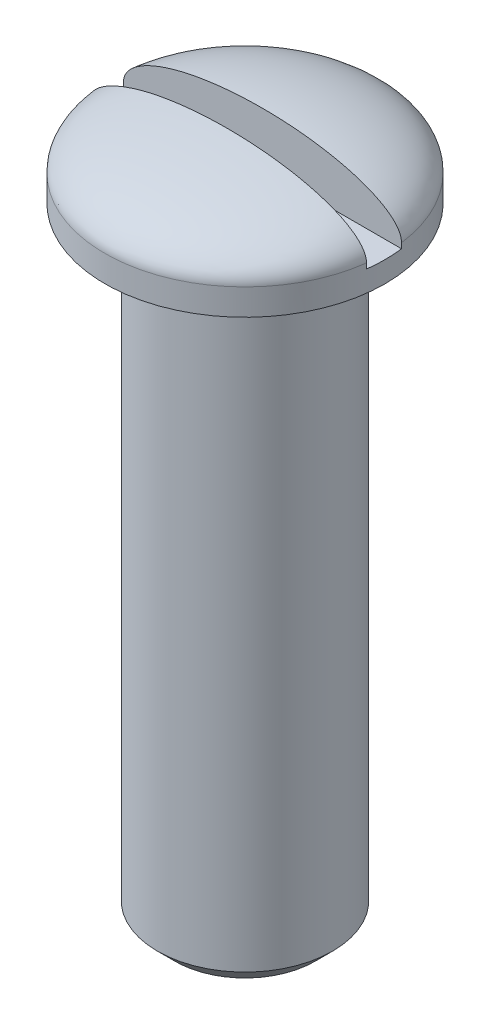
ISO-10303-21;
HEADER;
FILE_DESCRIPTION(('STEP AP214'),'2;1');
FILE_NAME('part.step','',(''),(''),'','','');
FILE_SCHEMA(('AUTOMOTIVE_DESIGN { 1 0 10303 214 1 1 1 1 }'));
ENDSEC;
DATA;
#1=APPLICATION_CONTEXT('core data for automotive mechanical design processes');
#2=APPLICATION_PROTOCOL_DEFINITION('international standard','automotive_design',2000,#1);
#3=PRODUCT_CONTEXT('',#1,'mechanical');
#4=PRODUCT('Part','Part','',(#3));
#5=PRODUCT_RELATED_PRODUCT_CATEGORY('part','',(#4));
#6=PRODUCT_DEFINITION_FORMATION('','',#4);
#7=PRODUCT_DEFINITION_CONTEXT('part definition',#1,'design');
#8=PRODUCT_DEFINITION('design','',#6,#7);
#9=PRODUCT_DEFINITION_SHAPE('','',#8);
#10=(LENGTH_UNIT() NAMED_UNIT(*) SI_UNIT(.MILLI.,.METRE.));
#11=(NAMED_UNIT(*) PLANE_ANGLE_UNIT() SI_UNIT($,.RADIAN.));
#12=(NAMED_UNIT(*) SI_UNIT($,.STERADIAN.) SOLID_ANGLE_UNIT());
#13=UNCERTAINTY_MEASURE_WITH_UNIT(LENGTH_MEASURE(1.E-05),#10,'distance_accuracy_value','');
#14=(GEOMETRIC_REPRESENTATION_CONTEXT(3) GLOBAL_UNCERTAINTY_ASSIGNED_CONTEXT((#13)) GLOBAL_UNIT_ASSIGNED_CONTEXT((#10,
#11,#12)) REPRESENTATION_CONTEXT('',''));
#15=CARTESIAN_POINT('',(0.,0.,0.));
#16=DIRECTION('',(0.,0.,1.));
#17=DIRECTION('',(1.,0.,0.));
#18=AXIS2_PLACEMENT_3D('',#15,#16,#17);
#19=CARTESIAN_POINT('',(0.,37.,0.));
#20=DIRECTION('',(0.,0.,1.));
#21=DIRECTION('',(1.,0.,0.));
#22=AXIS2_PLACEMENT_3D('',#19,#20,#21);
#23=ELLIPSE('',#22,8.,2.7);
#24=TRIMMED_CURVE('',#23,(PARAMETER_VALUE(-1.5707963267949)),(PARAMETER_VALUE(1.5707963267949)),
.T.,.PARAMETER.);
#25=CARTESIAN_POINT('',(0.,0.,0.));
#26=DIRECTION('',(0.,-1.,0.));
#27=AXIS1_PLACEMENT('',#25,#26);
#28=SURFACE_OF_REVOLUTION('',#24,#27);
#29=CARTESIAN_POINT('',(-7.93725393319377,37.,1.));
#30=CARTESIAN_POINT('',(-7.9372679539927,37.028425186696,1.));
#31=CARTESIAN_POINT('',(-7.93591384815377,37.0568421998398,1.));
#32=CARTESIAN_POINT('',(-7.93057860445809,37.1133921509441,1.));
#33=CARTESIAN_POINT('',(-7.92660092033622,37.141525413073,1.));
#34=CARTESIAN_POINT('',(-7.91619381617088,37.1969612867804,1.));
#35=CARTESIAN_POINT('',(-7.9097962183802,37.2242699119832,1.));
#36=CARTESIAN_POINT('',(-7.89472838102949,37.2782541235067,0.999999999999999));
#37=CARTESIAN_POINT('',(-7.88605729440098,37.3049294698286,0.999999999999997));
#38=CARTESIAN_POINT('',(-7.85178063449509,37.3977492993282,0.999999999999993));
#39=CARTESIAN_POINT('',(-7.82055716977038,37.461864801042,0.999999999999998));
#40=CARTESIAN_POINT('',(-7.74825690551775,37.5844958132068,1.));
#41=CARTESIAN_POINT('',(-7.70712574237137,37.6429778439168,1.));
#42=CARTESIAN_POINT('',(-7.62460477383432,37.7460593120359,1.));
#43=CARTESIAN_POINT('',(-7.58416021714071,37.7914307085018,1.));
#44=CARTESIAN_POINT('',(-7.49949954701128,37.8785364853327,1.));
#45=CARTESIAN_POINT('',(-7.45528055201993,37.920268036859,1.));
#46=CARTESIAN_POINT('',(-7.36394506845197,38.0005355231512,1.));
#47=CARTESIAN_POINT('',(-7.31682453080931,38.0390668075451,1.));
#48=CARTESIAN_POINT('',(-7.22040376655296,38.1132464906887,1.));
#49=CARTESIAN_POINT('',(-7.17110414952075,38.1488956878849,1.));
#50=CARTESIAN_POINT('',(-7.05152178589472,38.2308701890934,1.));
#51=CARTESIAN_POINT('',(-6.98044898629355,38.2760404643861,1.));
#52=CARTESIAN_POINT('',(-6.8358482477968,38.3622929197311,1.));
#53=CARTESIAN_POINT('',(-6.76231921632544,38.4033732472718,1.));
#54=CARTESIAN_POINT('',(-6.61329455065616,38.4820633862059,1.));
#55=CARTESIAN_POINT('',(-6.53779612171528,38.5196678782305,1.));
#56=CARTESIAN_POINT('',(-6.38533535109786,38.5917942620324,1.));
#57=CARTESIAN_POINT('',(-6.30837275926801,38.6263156212117,1.));
#58=CARTESIAN_POINT('',(-6.07504498630673,38.7261169145836,1.));
#59=CARTESIAN_POINT('',(-5.91691686569097,38.7872866492436,1.));
#60=CARTESIAN_POINT('',(-5.59773824980062,38.9007826154434,1.));
#61=CARTESIAN_POINT('',(-5.43669046126721,38.9531166162706,1.));
#62=CARTESIAN_POINT('',(-5.11838729614728,39.0486486509022,1.));
#63=CARTESIAN_POINT('',(-4.96121112165104,39.092112450686,1.));
#64=CARTESIAN_POINT('',(-4.64533614080023,39.173148532359,1.));
#65=CARTESIAN_POINT('',(-4.4866371255672,39.2107199934119,1.));
#66=CARTESIAN_POINT('',(-4.1678604359053,39.2806895318816,1.));
#67=CARTESIAN_POINT('',(-4.00778105851083,39.313079811176,1.));
#68=CARTESIAN_POINT('',(-3.68673226498379,39.3731227554639,1.));
#69=CARTESIAN_POINT('',(-3.52576278469573,39.4007750742435,1.));
#70=CARTESIAN_POINT('',(-3.0416024744178,39.4772597557472,1.));
#71=CARTESIAN_POINT('',(-2.7173689548059,39.5195751626911,1.));
#72=CARTESIAN_POINT('',(-2.06670375945056,39.5889826128706,1.));
#73=CARTESIAN_POINT('',(-1.74026908381822,39.6160456762821,1.));
#74=CARTESIAN_POINT('',(-1.0868675348501,39.6559517029133,1.));
#75=CARTESIAN_POINT('',(-0.759901523204662,39.6688088956982,1.));
#76=CARTESIAN_POINT('',(-0.105842030838195,39.6808640766637,1.));
#77=CARTESIAN_POINT('',(0.221251354184301,39.6800672551695,1.));
#78=CARTESIAN_POINT('',(0.805290745504496,39.6664179409489,1.));
#79=CARTESIAN_POINT('',(1.06230047698938,39.6561762053847,1.));
#80=CARTESIAN_POINT('',(1.5758871235112,39.6269652511818,1.));
#81=CARTESIAN_POINT('',(1.83246393174541,39.6079941266835,1.));
#82=CARTESIAN_POINT('',(2.34490379464668,39.5608224933159,1.));
#83=CARTESIAN_POINT('',(2.60076642804317,39.5326173721284,1.));
#84=CARTESIAN_POINT('',(3.10976030056053,39.4663704493105,1.));
#85=CARTESIAN_POINT('',(3.36289880378432,39.4283851568984,1.));
#86=CARTESIAN_POINT('',(3.86716913883653,39.3413164140507,1.));
#87=CARTESIAN_POINT('',(4.11830173526058,39.2922374239431,1.));
#88=CARTESIAN_POINT('',(4.61755910251831,39.1811940716012,1.));
#89=CARTESIAN_POINT('',(4.86568622251569,39.1192405666533,1.));
#90=CARTESIAN_POINT('',(5.20204631769779,39.0236658400096,1.));
#91=CARTESIAN_POINT('',(5.29223913160667,38.9968795643075,1.));
#92=CARTESIAN_POINT('',(5.47189294855613,38.9409436912467,1.));
#93=CARTESIAN_POINT('',(5.5613539536697,38.9117941005851,1.));
#94=CARTESIAN_POINT('',(5.73961871133747,38.8508089779762,1.));
#95=CARTESIAN_POINT('',(5.82842014912198,38.8189666570215,1.));
#96=CARTESIAN_POINT('',(6.00491789080109,38.7523528819634,1.));
#97=CARTESIAN_POINT('',(6.09261423406394,38.7175815325458,1.));
#98=CARTESIAN_POINT('',(6.2776295683126,38.6401174364544,1.));
#99=CARTESIAN_POINT('',(6.37476339184213,38.5969789898256,1.));
#100=CARTESIAN_POINT('',(6.56669545755528,38.5057942312038,1.));
#101=CARTESIAN_POINT('',(6.66149417144632,38.4577489206899,1.));
#102=CARTESIAN_POINT('',(6.84759019964439,38.3559697683412,1.));
#103=CARTESIAN_POINT('',(6.93889852072794,38.302256240792,1.));
#104=CARTESIAN_POINT('',(7.11693757439327,38.187786452014,1.));
#105=CARTESIAN_POINT('',(7.20367310459747,38.1270377947718,1.));
#106=CARTESIAN_POINT('',(7.35169707600426,38.0113239182405,1.));
#107=CARTESIAN_POINT('',(7.41433656069576,37.9581066351191,1.));
#108=CARTESIAN_POINT('',(7.53389423860408,37.8452426401833,1.));
#109=CARTESIAN_POINT('',(7.59079865654612,37.7855811292181,1.));
#110=CARTESIAN_POINT('',(7.69680275770274,37.6577690604176,1.));
#111=CARTESIAN_POINT('',(7.7457630485013,37.5894979859558,0.999999999999999));
#112=CARTESIAN_POINT('',(7.80882672013688,37.481331738079,1.));
#113=CARTESIAN_POINT('',(7.82807745616976,37.4444318562314,1.));
#114=CARTESIAN_POINT('',(7.86249520103261,37.3687911619656,0.999999999999999));
#115=CARTESIAN_POINT('',(7.87766543085493,37.3300518301273,0.999999999999997));
#116=CARTESIAN_POINT('',(7.90549829208587,37.2439124725726,0.999999999999997));
#117=CARTESIAN_POINT('',(7.91723093808099,37.1962001972984,0.999999999999999));
#118=CARTESIAN_POINT('',(7.92915192399331,37.123467437178,1.));
#119=CARTESIAN_POINT('',(7.93217994650022,37.0988886368039,1.));
#120=CARTESIAN_POINT('',(7.93623444838613,37.0495440864978,1.));
#121=CARTESIAN_POINT('',(7.93725906810871,37.0247781842705,1.));
#122=CARTESIAN_POINT('',(7.93725393319377,37.,1.));
#123=B_SPLINE_CURVE_WITH_KNOTS('',3,(#29,#30,#31,#32,#33,#34,#35,#36,#37,#38,#39,#40,#41,#42,
#43,#44,#45,#46,#47,#48,#49,#50,#51,#52,#53,#54,#55,#56,#57,#58,#59,#60,#61,#62,#63,#64,#65,#66,
#67,#68,#69,#70,#71,#72,#73,#74,#75,#76,#77,#78,#79,#80,#81,#82,#83,#84,#85,#86,#87,#88,#89,#90,
#91,#92,#93,#94,#95,#96,#97,#98,#99,#100,#101,#102,#103,#104,#105,#106,#107,#108,#109,#110,#111,
#112,#113,#114,#115,#116,#117,#118,#119,#120,#121,#122),.UNSPECIFIED.,.F.,.F.,(4,2,2,2,2,2,2,2,
2,2,2,2,2,2,2,2,2,2,2,2,2,2,2,2,2,2,2,2,2,2,2,2,2,2,2,2,2,2,2,2,2,2,2,2,2,2,4),(0.,
0.085230121730039,0.170348268030959,0.254383958606268,0.33845100424637,0.551085654244598,
0.764914730326498,0.946993520486736,1.12921258182631,1.31169195823799,1.494120606517,
1.7465796309848,1.99915248957964,2.25210569478696,2.50510251241691,3.01337352121526,
3.52119525149152,4.01028728520159,4.49944739181178,4.98933693637674,5.47926226308226,
6.45975371972949,7.44210190711809,8.42346521325528,9.40445548025946,10.1759607647509,
10.9476345695116,11.7196944096484,12.487389709664,13.2547768976915,14.0215195429876,
14.3037539915994,14.5859876404534,14.8689553875985,15.1519130255422,15.4706443815909,
15.7893108148479,16.1068716569271,16.4240924087716,16.6703252972271,16.917136190868,
17.1678947543991,17.2925517948105,17.4171101451146,17.5638867740028,17.6381082525873,
17.71239859453),.UNSPECIFIED.);
#124=CARTESIAN_POINT('',(-7.93725393319377,37.,1.));
#125=VERTEX_POINT('',#124);
#126=CARTESIAN_POINT('',(7.93725393319377,37.,1.));
#127=VERTEX_POINT('',#126);
#128=EDGE_CURVE('E69',#125,#127,#123,.T.);
#129=ORIENTED_EDGE('',*,*,#128,.F.);
#130=CARTESIAN_POINT('',(0.,37.,0.));
#131=DIRECTION('',(0.,-1.,0.));
#132=DIRECTION('',(1.,0.,0.));
#133=AXIS2_PLACEMENT_3D('',#130,#131,#132);
#134=CIRCLE('',#133,8.);
#135=EDGE_CURVE('E155',#127,#125,#134,.T.);
#136=ORIENTED_EDGE('',*,*,#135,.F.);
#137=EDGE_LOOP('',(#129,#136));
#138=FACE_BOUND('',#137,.T.);
#139=ADVANCED_FACE('F45',(#138),#28,.F.);
#140=CARTESIAN_POINT('',(0.,0.,0.));
#141=DIRECTION('',(0.,-1.,0.));
#142=DIRECTION('',(1.,0.,0.));
#143=AXIS2_PLACEMENT_3D('',#140,#141,#142);
#144=PLANE('',#143);
#145=CARTESIAN_POINT('',(0.,0.,0.));
#146=DIRECTION('',(0.,-1.,0.));
#147=DIRECTION('',(1.,0.,0.));
#148=AXIS2_PLACEMENT_3D('',#145,#146,#147);
#149=CIRCLE('',#148,3.99999999999999);
#150=CARTESIAN_POINT('',(3.99999999999999,0.,0.));
#151=VERTEX_POINT('',#150);
#152=EDGE_CURVE('E162',#151,#151,#149,.T.);
#153=ORIENTED_EDGE('',*,*,#152,.T.);
#154=EDGE_LOOP('',(#153));
#155=FACE_BOUND('',#154,.T.);
#156=ADVANCED_FACE('F146',(#155),#144,.T.);
#157=CARTESIAN_POINT('',(0.,0.,0.));
#158=DIRECTION('',(0.,-1.,0.));
#159=DIRECTION('',(1.,0.,0.));
#160=AXIS2_PLACEMENT_3D('',#157,#158,#159);
#161=CYLINDRICAL_SURFACE('',#160,5.);
#162=CARTESIAN_POINT('',(0.,1.00000000000001,0.));
#163=DIRECTION('',(0.,-1.,0.));
#164=DIRECTION('',(1.,0.,0.));
#165=AXIS2_PLACEMENT_3D('',#162,#163,#164);
#166=CIRCLE('',#165,5.);
#167=CARTESIAN_POINT('',(5.,1.00000000000001,0.));
#168=VERTEX_POINT('',#167);
#169=EDGE_CURVE('E166',#168,#168,#166,.F.);
#170=ORIENTED_EDGE('',*,*,#169,.T.);
#171=EDGE_LOOP('',(#170));
#172=FACE_BOUND('',#171,.T.);
#173=CARTESIAN_POINT('',(0.,35.5,0.));
#174=DIRECTION('',(0.,-1.,0.));
#175=DIRECTION('',(1.,0.,0.));
#176=AXIS2_PLACEMENT_3D('',#173,#174,#175);
#177=CIRCLE('',#176,5.);
#178=CARTESIAN_POINT('',(5.,35.5,0.));
#179=VERTEX_POINT('',#178);
#180=EDGE_CURVE('E158',#179,#179,#177,.T.);
#181=ORIENTED_EDGE('',*,*,#180,.T.);
#182=EDGE_LOOP('',(#181));
#183=FACE_BOUND('',#182,.T.);
#184=ADVANCED_FACE('F151',(#172,#183),#161,.T.);
#185=CARTESIAN_POINT('',(5.,35.5,0.));
#186=DIRECTION('',(0.,-1.,0.));
#187=DIRECTION('',(1.,0.,0.));
#188=AXIS2_PLACEMENT_3D('',#185,#186,#187);
#189=PLANE('',#188);
#190=CARTESIAN_POINT('',(0.,35.5,0.));
#191=DIRECTION('',(0.,-1.,0.));
#192=DIRECTION('',(1.,0.,0.));
#193=AXIS2_PLACEMENT_3D('',#190,#191,#192);
#194=CIRCLE('',#193,8.);
#195=CARTESIAN_POINT('',(8.,35.5,0.));
#196=VERTEX_POINT('',#195);
#197=EDGE_CURVE('E156',#196,#196,#194,.T.);
#198=ORIENTED_EDGE('',*,*,#197,.T.);
#199=EDGE_LOOP('',(#198));
#200=FACE_BOUND('',#199,.T.);
#201=ORIENTED_EDGE('',*,*,#180,.F.);
#202=EDGE_LOOP('',(#201));
#203=FACE_BOUND('',#202,.T.);
#204=ADVANCED_FACE('F217',(#200,#203),#189,.T.);
#205=CARTESIAN_POINT('',(0.,0.,0.));
#206=DIRECTION('',(0.,-1.,0.));
#207=DIRECTION('',(1.,0.,0.));
#208=AXIS2_PLACEMENT_3D('',#205,#206,#207);
#209=CYLINDRICAL_SURFACE('',#208,8.);
#210=DIRECTION('',(0.,-1.,0.));
#211=VECTOR('',#210,1.);
#212=CARTESIAN_POINT('',(-7.93725393319377,0.,1.));
#213=LINE('',#212,#211);
#214=CARTESIAN_POINT('',(-7.93725393319377,36.7,1.));
#215=VERTEX_POINT('',#214);
#216=EDGE_CURVE('E106',#215,#125,#213,.F.);
#217=ORIENTED_EDGE('',*,*,#216,.F.);
#218=CARTESIAN_POINT('',(0.,36.7,0.));
#219=DIRECTION('',(0.,-1.,0.));
#220=DIRECTION('',(0.,0.,-1.));
#221=AXIS2_PLACEMENT_3D('',#218,#219,#220);
#222=CIRCLE('',#221,8.);
#223=CARTESIAN_POINT('',(-7.93725393319377,36.7,-1.));
#224=VERTEX_POINT('',#223);
#225=EDGE_CURVE('E11',#224,#215,#222,.F.);
#226=ORIENTED_EDGE('',*,*,#225,.F.);
#227=DIRECTION('',(0.,-1.,0.));
#228=VECTOR('',#227,1.);
#229=CARTESIAN_POINT('',(-7.93725393319377,0.,-1.));
#230=LINE('',#229,#228);
#231=CARTESIAN_POINT('',(-7.93725393319377,37.,-1.));
#232=VERTEX_POINT('',#231);
#233=EDGE_CURVE('E96',#232,#224,#230,.T.);
#234=ORIENTED_EDGE('',*,*,#233,.F.);
#235=CARTESIAN_POINT('',(7.93725393319377,37.,-1.));
#236=VERTEX_POINT('',#235);
#237=EDGE_CURVE('E103',#232,#236,#134,.T.);
#238=ORIENTED_EDGE('',*,*,#237,.T.);
#239=DIRECTION('',(0.,-1.,0.));
#240=VECTOR('',#239,1.);
#241=CARTESIAN_POINT('',(7.93725393319377,0.,-1.));
#242=LINE('',#241,#240);
#243=CARTESIAN_POINT('',(7.93725393319377,36.7,-1.));
#244=VERTEX_POINT('',#243);
#245=EDGE_CURVE('E61',#244,#236,#242,.F.);
#246=ORIENTED_EDGE('',*,*,#245,.F.);
#247=CARTESIAN_POINT('',(7.93725393319377,36.7,1.));
#248=VERTEX_POINT('',#247);
#249=EDGE_CURVE('E50',#248,#244,#222,.F.);
#250=ORIENTED_EDGE('',*,*,#249,.F.);
#251=DIRECTION('',(0.,-1.,0.));
#252=VECTOR('',#251,1.);
#253=CARTESIAN_POINT('',(7.93725393319377,0.,1.));
#254=LINE('',#253,#252);
#255=EDGE_CURVE('E104',#127,#248,#254,.T.);
#256=ORIENTED_EDGE('',*,*,#255,.F.);
#257=ORIENTED_EDGE('',*,*,#135,.T.);
#258=EDGE_LOOP('',(#217,#226,#234,#238,#246,#250,#256,#257));
#259=FACE_BOUND('',#258,.T.);
#260=ORIENTED_EDGE('',*,*,#197,.F.);
#261=EDGE_LOOP('',(#260));
#262=FACE_BOUND('',#261,.T.);
#263=ADVANCED_FACE('F100',(#259,#262),#209,.T.);
#264=CARTESIAN_POINT('',(7.93725393319377,37.,-1.));
#265=CARTESIAN_POINT('',(7.9372679539927,37.028425186696,-1.));
#266=CARTESIAN_POINT('',(7.93591384815377,37.0568421998398,-1.));
#267=CARTESIAN_POINT('',(7.93057860445809,37.1133921509441,-1.));
#268=CARTESIAN_POINT('',(7.92660092033622,37.141525413073,-1.));
#269=CARTESIAN_POINT('',(7.91619381617087,37.1969612867804,-1.));
#270=CARTESIAN_POINT('',(7.9097962183802,37.2242699119832,-1.));
#271=CARTESIAN_POINT('',(7.89472838102949,37.2782541235067,-0.999999999999999));
#272=CARTESIAN_POINT('',(7.88605729440098,37.3049294698286,-0.999999999999998));
#273=CARTESIAN_POINT('',(7.85178063449509,37.3977492993282,-0.999999999999995));
#274=CARTESIAN_POINT('',(7.82055716977038,37.461864801042,-0.999999999999998));
#275=CARTESIAN_POINT('',(7.74825690551775,37.5844958132068,-1.));
#276=CARTESIAN_POINT('',(7.70712574237137,37.6429778439168,-1.));
#277=CARTESIAN_POINT('',(7.62460477383432,37.7460593120359,-1.));
#278=CARTESIAN_POINT('',(7.58416021714071,37.7914307085019,-1.));
#279=CARTESIAN_POINT('',(7.49949954701128,37.8785364853327,-1.));
#280=CARTESIAN_POINT('',(7.45528055201992,37.920268036859,-1.));
#281=CARTESIAN_POINT('',(7.36394506845197,38.0005355231512,-1.));
#282=CARTESIAN_POINT('',(7.31682453080931,38.0390668075451,-1.));
#283=CARTESIAN_POINT('',(7.22040376655296,38.1132464906887,-1.));
#284=CARTESIAN_POINT('',(7.17110414952075,38.1488956878849,-1.));
#285=CARTESIAN_POINT('',(7.05152178589472,38.2308701890934,-1.));
#286=CARTESIAN_POINT('',(6.98044898629355,38.2760404643861,-1.));
#287=CARTESIAN_POINT('',(6.8358482477968,38.3622929197311,-0.999999999999999));
#288=CARTESIAN_POINT('',(6.76231921632544,38.4033732472718,-1.));
#289=CARTESIAN_POINT('',(6.61329455065617,38.4820633862059,-1.));
#290=CARTESIAN_POINT('',(6.53779612171528,38.5196678782305,-1.));
#291=CARTESIAN_POINT('',(6.38533535109786,38.5917942620324,-1.));
#292=CARTESIAN_POINT('',(6.30837275926801,38.6263156212117,-1.));
#293=CARTESIAN_POINT('',(6.07504498630673,38.7261169145836,-1.));
#294=CARTESIAN_POINT('',(5.91691686569096,38.7872866492436,-1.));
#295=CARTESIAN_POINT('',(5.59773824980061,38.9007826154434,-1.));
#296=CARTESIAN_POINT('',(5.4366904612672,38.9531166162706,-1.));
#297=CARTESIAN_POINT('',(5.11838729614728,39.0486486509022,-1.));
#298=CARTESIAN_POINT('',(4.96121112165104,39.092112450686,-1.));
#299=CARTESIAN_POINT('',(4.64533614080023,39.173148532359,-1.));
#300=CARTESIAN_POINT('',(4.4866371255672,39.2107199934119,-1.));
#301=CARTESIAN_POINT('',(4.1678604359053,39.2806895318816,-1.));
#302=CARTESIAN_POINT('',(4.00778105851082,39.313079811176,-1.));
#303=CARTESIAN_POINT('',(3.68673226498379,39.3731227554639,-1.));
#304=CARTESIAN_POINT('',(3.52576278469573,39.4007750742435,-1.));
#305=CARTESIAN_POINT('',(3.04160247441779,39.4772597557472,-1.));
#306=CARTESIAN_POINT('',(2.7173689548059,39.5195751626911,-1.));
#307=CARTESIAN_POINT('',(2.06670375945055,39.5889826128706,-1.));
#308=CARTESIAN_POINT('',(1.74026908381821,39.6160456762821,-1.));
#309=CARTESIAN_POINT('',(1.0868675348501,39.6559517029133,-1.));
#310=CARTESIAN_POINT('',(0.759901523204655,39.6688088956982,-1.));
#311=CARTESIAN_POINT('',(0.105842030838188,39.6808640766637,-1.));
#312=CARTESIAN_POINT('',(-0.221251354184309,39.6800672551695,-0.999999999999999));
#313=CARTESIAN_POINT('',(-0.805290745504502,39.6664179409489,-0.999999999999999));
#314=CARTESIAN_POINT('',(-1.06230047698939,39.6561762053847,-1.));
#315=CARTESIAN_POINT('',(-1.5758871235112,39.6269652511818,-1.));
#316=CARTESIAN_POINT('',(-1.83246393174541,39.6079941266835,-1.));
#317=CARTESIAN_POINT('',(-2.34490379464668,39.5608224933159,-1.));
#318=CARTESIAN_POINT('',(-2.60076642804317,39.5326173721284,-1.));
#319=CARTESIAN_POINT('',(-3.10976030056052,39.4663704493105,-1.));
#320=CARTESIAN_POINT('',(-3.36289880378431,39.4283851568984,-1.));
#321=CARTESIAN_POINT('',(-3.86716913883652,39.3413164140507,-1.));
#322=CARTESIAN_POINT('',(-4.11830173526056,39.2922374239431,-1.));
#323=CARTESIAN_POINT('',(-4.61755910251829,39.1811940716012,-1.));
#324=CARTESIAN_POINT('',(-4.86568622251567,39.1192405666533,-1.));
#325=CARTESIAN_POINT('',(-5.20204631769776,39.0236658400096,-1.));
#326=CARTESIAN_POINT('',(-5.29223913160664,38.9968795643075,-1.));
#327=CARTESIAN_POINT('',(-5.47189294855611,38.9409436912467,-1.));
#328=CARTESIAN_POINT('',(-5.56135395366969,38.9117941005851,-1.));
#329=CARTESIAN_POINT('',(-5.73961871133745,38.8508089779762,-1.));
#330=CARTESIAN_POINT('',(-5.82842014912197,38.8189666570215,-1.));
#331=CARTESIAN_POINT('',(-6.00491789080107,38.7523528819634,-1.));
#332=CARTESIAN_POINT('',(-6.09261423406392,38.7175815325458,-1.));
#333=CARTESIAN_POINT('',(-6.27762956831259,38.6401174364544,-1.));
#334=CARTESIAN_POINT('',(-6.37476339184211,38.5969789898256,-1.));
#335=CARTESIAN_POINT('',(-6.56669545755526,38.5057942312038,-1.));
#336=CARTESIAN_POINT('',(-6.66149417144631,38.4577489206899,-1.));
#337=CARTESIAN_POINT('',(-6.84759019964437,38.3559697683412,-1.));
#338=CARTESIAN_POINT('',(-6.93889852072792,38.302256240792,-1.));
#339=CARTESIAN_POINT('',(-7.11693757439326,38.187786452014,-1.));
#340=CARTESIAN_POINT('',(-7.20367310459746,38.1270377947718,-1.));
#341=CARTESIAN_POINT('',(-7.35169707600426,38.0113239182405,-1.));
#342=CARTESIAN_POINT('',(-7.41433656069576,37.9581066351191,-1.));
#343=CARTESIAN_POINT('',(-7.53389423860408,37.8452426401833,-1.));
#344=CARTESIAN_POINT('',(-7.59079865654611,37.7855811292181,-0.999999999999999));
#345=CARTESIAN_POINT('',(-7.69680275770273,37.6577690604176,-0.999999999999999));
#346=CARTESIAN_POINT('',(-7.74576304850129,37.5894979859559,-0.999999999999999));
#347=CARTESIAN_POINT('',(-7.80882672013687,37.481331738079,-1.));
#348=CARTESIAN_POINT('',(-7.82807745616975,37.4444318562314,-1.));
#349=CARTESIAN_POINT('',(-7.8624952010326,37.3687911619656,-0.999999999999999));
#350=CARTESIAN_POINT('',(-7.87766543085493,37.3300518301273,-0.999999999999997));
#351=CARTESIAN_POINT('',(-7.90549829208588,37.2439124725726,-0.999999999999996));
#352=CARTESIAN_POINT('',(-7.91723093808099,37.1962001972984,-0.999999999999999));
#353=CARTESIAN_POINT('',(-7.92915192399331,37.123467437178,-1.));
#354=CARTESIAN_POINT('',(-7.93217994650022,37.0988886368039,-1.));
#355=CARTESIAN_POINT('',(-7.93623444838613,37.0495440864978,-1.));
#356=CARTESIAN_POINT('',(-7.93725906810871,37.0247781842705,-0.999999999999999));
#357=CARTESIAN_POINT('',(-7.93725393319377,37.,-0.999999999999999));
#358=B_SPLINE_CURVE_WITH_KNOTS('',3,(#264,#265,#266,#267,#268,#269,#270,#271,#272,#273,#274,
#275,#276,#277,#278,#279,#280,#281,#282,#283,#284,#285,#286,#287,#288,#289,#290,#291,#292,#293,
#294,#295,#296,#297,#298,#299,#300,#301,#302,#303,#304,#305,#306,#307,#308,#309,#310,#311,#312,
#313,#314,#315,#316,#317,#318,#319,#320,#321,#322,#323,#324,#325,#326,#327,#328,#329,#330,#331,
#332,#333,#334,#335,#336,#337,#338,#339,#340,#341,#342,#343,#344,#345,#346,#347,#348,#349,#350,
#351,#352,#353,#354,#355,#356,#357),.UNSPECIFIED.,.F.,.F.,(4,2,2,2,2,2,2,2,2,2,2,2,2,2,2,2,2,2,
2,2,2,2,2,2,2,2,2,2,2,2,2,2,2,2,2,2,2,2,2,2,2,2,2,2,2,2,4),(0.,0.085230121730039,
0.17034826803096,0.254383958606268,0.33845100424637,0.551085654244604,0.764914730326505,
0.946993520486745,1.12921258182632,1.311691958238,1.494120606517,1.7465796309848,
1.99915248957964,2.25210569478696,2.50510251241692,3.01337352121526,3.52119525149153,
4.0102872852016,4.49944739181178,4.98933693637675,5.47926226308226,6.4597537197295,
7.44210190711809,8.42346521325529,9.40445548025947,10.1759607647509,10.9476345695116,
11.7196944096484,12.487389709664,13.2547768976915,14.0215195429876,14.3037539915994,
14.5859876404534,14.8689553875985,15.1519130255421,15.4706443815909,15.7893108148479,
16.1068716569271,16.4240924087716,16.6703252972271,16.917136190868,17.1678947543991,
17.2925517948105,17.4171101451146,17.5638867740028,17.6381082525873,17.71239859453),.UNSPECIFIED.);
#359=EDGE_CURVE('E127',#236,#232,#358,.T.);
#360=ORIENTED_EDGE('',*,*,#359,.F.);
#361=ORIENTED_EDGE('',*,*,#237,.F.);
#362=EDGE_LOOP('',(#360,#361));
#363=FACE_BOUND('',#362,.T.);
#364=ADVANCED_FACE('F116',(#363),#28,.F.);
#365=CARTESIAN_POINT('',(0.,0.,0.));
#366=DIRECTION('',(0.,1.,0.));
#367=DIRECTION('',(-1.,0.,0.));
#368=AXIS2_PLACEMENT_3D('',#365,#366,#367);
#369=CONICAL_SURFACE('',#368,3.99999999999999,0.78539816339745);
#370=ORIENTED_EDGE('',*,*,#169,.F.);
#371=EDGE_LOOP('',(#370));
#372=FACE_BOUND('',#371,.T.);
#373=ORIENTED_EDGE('',*,*,#152,.F.);
#374=EDGE_LOOP('',(#373));
#375=FACE_BOUND('',#374,.T.);
#376=ADVANCED_FACE('F48',(#372,#375),#369,.T.);
#377=CARTESIAN_POINT('',(-8.,36.7,1.));
#378=DIRECTION('',(0.,0.,1.));
#379=DIRECTION('',(1.,0.,0.));
#380=AXIS2_PLACEMENT_3D('',#377,#378,#379);
#381=PLANE('',#380);
#382=ORIENTED_EDGE('',*,*,#216,.T.);
#383=ORIENTED_EDGE('',*,*,#128,.T.);
#384=ORIENTED_EDGE('',*,*,#255,.T.);
#385=DIRECTION('',(1.,0.,0.));
#386=VECTOR('',#385,1.);
#387=CARTESIAN_POINT('',(-8.,36.7,1.));
#388=LINE('',#387,#386);
#389=EDGE_CURVE('E91',#215,#248,#388,.T.);
#390=ORIENTED_EDGE('',*,*,#389,.F.);
#391=EDGE_LOOP('',(#382,#383,#384,#390));
#392=FACE_BOUND('',#391,.T.);
#393=ADVANCED_FACE('F137',(#392),#381,.F.);
#394=CARTESIAN_POINT('',(-8.,36.7,-1.));
#395=DIRECTION('',(0.,0.,-1.));
#396=DIRECTION('',(-1.,0.,0.));
#397=AXIS2_PLACEMENT_3D('',#394,#395,#396);
#398=PLANE('',#397);
#399=ORIENTED_EDGE('',*,*,#245,.T.);
#400=ORIENTED_EDGE('',*,*,#359,.T.);
#401=ORIENTED_EDGE('',*,*,#233,.T.);
#402=DIRECTION('',(-1.,0.,0.));
#403=VECTOR('',#402,1.);
#404=CARTESIAN_POINT('',(-8.,36.7,-1.));
#405=LINE('',#404,#403);
#406=EDGE_CURVE('E89',#244,#224,#405,.T.);
#407=ORIENTED_EDGE('',*,*,#406,.F.);
#408=EDGE_LOOP('',(#399,#400,#401,#407));
#409=FACE_BOUND('',#408,.T.);
#410=ADVANCED_FACE('F94',(#409),#398,.F.);
#411=CARTESIAN_POINT('',(0.,36.7,0.));
#412=DIRECTION('',(0.,-1.,0.));
#413=DIRECTION('',(0.,0.,-1.));
#414=AXIS2_PLACEMENT_3D('',#411,#412,#413);
#415=PLANE('',#414);
#416=ORIENTED_EDGE('',*,*,#406,.T.);
#417=ORIENTED_EDGE('',*,*,#225,.T.);
#418=ORIENTED_EDGE('',*,*,#389,.T.);
#419=ORIENTED_EDGE('',*,*,#249,.T.);
#420=EDGE_LOOP('',(#416,#417,#418,#419));
#421=FACE_BOUND('',#420,.T.);
#422=ADVANCED_FACE('F88',(#421),#415,.F.);
#423=CLOSED_SHELL('',(#139,#156,#184,#204,#263,#364,#376,#393,#410,#422));
#424=MANIFOLD_SOLID_BREP('B2',#423);
#425=ADVANCED_BREP_SHAPE_REPRESENTATION('',(#18,#424),#14);
#426=SHAPE_DEFINITION_REPRESENTATION(#9,#425);
ENDSEC;
END-ISO-10303-21;
